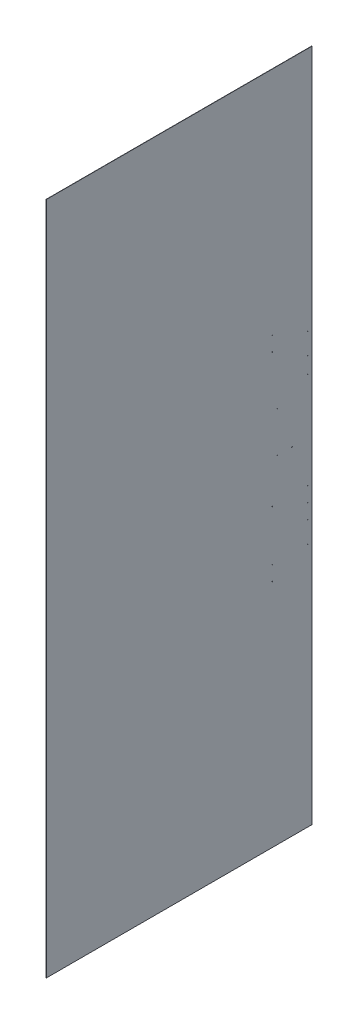
ISO-10303-21;
HEADER;
FILE_DESCRIPTION(('STEP AP214'),'2;1');
FILE_NAME('part.step','',(''),(''),'','','');
FILE_SCHEMA(('AUTOMOTIVE_DESIGN { 1 0 10303 214 1 1 1 1 }'));
ENDSEC;
DATA;
#1=APPLICATION_CONTEXT('core data for automotive mechanical design processes');
#2=APPLICATION_PROTOCOL_DEFINITION('international standard','automotive_design',2000,#1);
#3=PRODUCT_CONTEXT('',#1,'mechanical');
#4=PRODUCT('Part','Part','',(#3));
#5=PRODUCT_RELATED_PRODUCT_CATEGORY('part','',(#4));
#6=PRODUCT_DEFINITION_FORMATION('','',#4);
#7=PRODUCT_DEFINITION_CONTEXT('part definition',#1,'design');
#8=PRODUCT_DEFINITION('design','',#6,#7);
#9=PRODUCT_DEFINITION_SHAPE('','',#8);
#10=(LENGTH_UNIT() NAMED_UNIT(*) SI_UNIT(.MILLI.,.METRE.));
#11=(NAMED_UNIT(*) PLANE_ANGLE_UNIT() SI_UNIT($,.RADIAN.));
#12=(NAMED_UNIT(*) SI_UNIT($,.STERADIAN.) SOLID_ANGLE_UNIT());
#13=UNCERTAINTY_MEASURE_WITH_UNIT(LENGTH_MEASURE(1.E-05),#10,'distance_accuracy_value','');
#14=(GEOMETRIC_REPRESENTATION_CONTEXT(3) GLOBAL_UNCERTAINTY_ASSIGNED_CONTEXT((#13)) GLOBAL_UNIT_ASSIGNED_CONTEXT((#10,
#11,#12)) REPRESENTATION_CONTEXT('',''));
#15=CARTESIAN_POINT('',(0.,0.,0.));
#16=DIRECTION('',(0.,0.,1.));
#17=DIRECTION('',(1.,0.,0.));
#18=AXIS2_PLACEMENT_3D('',#15,#16,#17);
#19=CARTESIAN_POINT('',(1100.37499886222,-0.0500397908136385,1361.5));
#20=DIRECTION('',(-4.54752160072536E-05,-0.999999998966002,0.));
#21=DIRECTION('',(0.,0.,1.));
#22=AXIS2_PLACEMENT_3D('',#19,#20,#21);
#23=PLANE('',#22);
#24=DIRECTION('',(-0.999999998966002,4.54752160072536E-05,0.));
#25=VECTOR('',#24,1.);
#26=CARTESIAN_POINT('',(1100.37499886222,-0.0500397908131944,2723.));
#27=LINE('',#26,#25);
#28=CARTESIAN_POINT('',(1101.99999886054,-0.0501136880379782,2723.));
#29=VERTEX_POINT('',#28);
#30=CARTESIAN_POINT('',(1099.49999886312,-0.0499999999981071,2723.));
#31=VERTEX_POINT('',#30);
#32=EDGE_CURVE('E12',#29,#31,#27,.T.);
#33=ORIENTED_EDGE('',*,*,#32,.F.);
#34=DIRECTION('',(0.,0.,1.));
#35=VECTOR('',#34,1.);
#36=CARTESIAN_POINT('',(1101.99999886054,-0.0501136880379782,1361.5));
#37=LINE('',#36,#35);
#38=CARTESIAN_POINT('',(1101.99999886054,-0.0501136880379782,-4.44089209850063E-13));
#39=VERTEX_POINT('',#38);
#40=EDGE_CURVE('E79',#29,#39,#37,.F.);
#41=ORIENTED_EDGE('',*,*,#40,.T.);
#42=DIRECTION('',(-0.999999998966002,4.54752160072536E-05,0.));
#43=VECTOR('',#42,1.);
#44=CARTESIAN_POINT('',(1100.37499886222,-0.0500397908131944,0.));
#45=LINE('',#44,#43);
#46=CARTESIAN_POINT('',(1099.49999886312,-0.0499999999981071,-4.44089209850063E-13));
#47=VERTEX_POINT('',#46);
#48=EDGE_CURVE('E51',#39,#47,#45,.T.);
#49=ORIENTED_EDGE('',*,*,#48,.T.);
#50=DIRECTION('',(0.,0.,1.));
#51=VECTOR('',#50,1.);
#52=CARTESIAN_POINT('',(1099.49999886312,-0.0499999999981071,1361.5));
#53=LINE('',#52,#51);
#54=EDGE_CURVE('E81',#31,#47,#53,.F.);
#55=ORIENTED_EDGE('',*,*,#54,.F.);
#56=EDGE_LOOP('',(#33,#41,#49,#55));
#57=FACE_BOUND('',#56,.T.);
#58=ADVANCED_FACE('F41',(#57),#23,.F.);
#59=CARTESIAN_POINT('',(1100.21779649858,-3456.93001261945,-4.44089209850063E-13));
#60=DIRECTION('',(0.,0.,-1.));
#61=DIRECTION('',(-4.54752160072536E-05,-0.999999998966003,0.));
#62=AXIS2_PLACEMENT_3D('',#59,#60,#61);
#63=PLANE('',#62);
#64=ORIENTED_EDGE('',*,*,#48,.F.);
#65=DIRECTION('',(-4.54752160072536E-05,-0.999999998966003,0.));
#66=VECTOR('',#65,1.);
#67=CARTESIAN_POINT('',(1101.8427964969,-3456.93008651668,-4.44089209850063E-13));
#68=LINE('',#67,#66);
#69=CARTESIAN_POINT('',(1101.68559413326,-6913.81005934532,-1.11022302462516E-12));
#70=VERTEX_POINT('',#69);
#71=EDGE_CURVE('E93',#39,#70,#68,.T.);
#72=ORIENTED_EDGE('',*,*,#71,.T.);
#73=DIRECTION('',(-0.999999998966002,4.54752160072536E-05,0.));
#74=VECTOR('',#73,1.);
#75=CARTESIAN_POINT('',(1100.06059413494,-6913.80998544809,-6.66133814775094E-13));
#76=LINE('',#75,#74);
#77=CARTESIAN_POINT('',(1099.18559413584,-6913.80994565727,-1.11022302462516E-12));
#78=VERTEX_POINT('',#77);
#79=EDGE_CURVE('E103',#70,#78,#76,.T.);
#80=ORIENTED_EDGE('',*,*,#79,.T.);
#81=DIRECTION('',(-4.54752160072536E-05,-0.999999998966003,0.));
#82=VECTOR('',#81,1.);
#83=CARTESIAN_POINT('',(1099.34279649948,-3456.92997282864,-4.44089209850063E-13));
#84=LINE('',#83,#82);
#85=EDGE_CURVE('E98',#47,#78,#84,.T.);
#86=ORIENTED_EDGE('',*,*,#85,.F.);
#87=EDGE_LOOP('',(#64,#72,#80,#86));
#88=FACE_BOUND('',#87,.T.);
#89=ADVANCED_FACE('F111',(#88),#63,.T.);
#90=CARTESIAN_POINT('',(1100.06059413494,-6913.80998544809,1361.5));
#91=DIRECTION('',(-4.54752160072536E-05,-0.999999998966002,0.));
#92=DIRECTION('',(0.,0.,1.));
#93=AXIS2_PLACEMENT_3D('',#90,#91,#92);
#94=PLANE('',#93);
#95=ORIENTED_EDGE('',*,*,#79,.F.);
#96=DIRECTION('',(0.,0.,1.));
#97=VECTOR('',#96,1.);
#98=CARTESIAN_POINT('',(1101.68559413326,-6913.81005934532,1361.5));
#99=LINE('',#98,#97);
#100=CARTESIAN_POINT('',(1101.68559413326,-6913.81005934532,2723.));
#101=VERTEX_POINT('',#100);
#102=EDGE_CURVE('E96',#70,#101,#99,.T.);
#103=ORIENTED_EDGE('',*,*,#102,.T.);
#104=DIRECTION('',(-0.999999998966002,4.54752160072536E-05,0.));
#105=VECTOR('',#104,1.);
#106=CARTESIAN_POINT('',(1100.06059413494,-6913.80998544809,2723.));
#107=LINE('',#106,#105);
#108=CARTESIAN_POINT('',(1099.18559413584,-6913.80994565728,2723.));
#109=VERTEX_POINT('',#108);
#110=EDGE_CURVE('E45',#101,#109,#107,.T.);
#111=ORIENTED_EDGE('',*,*,#110,.T.);
#112=DIRECTION('',(0.,0.,1.));
#113=VECTOR('',#112,1.);
#114=CARTESIAN_POINT('',(1099.18559413584,-6913.80994565727,1361.5));
#115=LINE('',#114,#113);
#116=EDGE_CURVE('E112',#78,#109,#115,.T.);
#117=ORIENTED_EDGE('',*,*,#116,.F.);
#118=EDGE_LOOP('',(#95,#103,#111,#117));
#119=FACE_BOUND('',#118,.T.);
#120=ADVANCED_FACE('F255',(#119),#94,.T.);
#121=CARTESIAN_POINT('',(1100.21779649858,-3456.93001261945,2723.));
#122=DIRECTION('',(0.,0.,-1.));
#123=DIRECTION('',(-4.54752160072536E-05,-0.999999998966003,0.));
#124=AXIS2_PLACEMENT_3D('',#121,#122,#123);
#125=PLANE('',#124);
#126=DIRECTION('',(-4.54752160072536E-05,-0.999999998966003,0.));
#127=VECTOR('',#126,1.);
#128=CARTESIAN_POINT('',(1101.8427964969,-3456.93008651668,2723.));
#129=LINE('',#128,#127);
#130=EDGE_CURVE('E91',#101,#29,#129,.F.);
#131=ORIENTED_EDGE('',*,*,#130,.T.);
#132=ORIENTED_EDGE('',*,*,#32,.T.);
#133=DIRECTION('',(-4.54752160072536E-05,-0.999999998966003,0.));
#134=VECTOR('',#133,1.);
#135=CARTESIAN_POINT('',(1099.34279649948,-3456.92997282864,2723.));
#136=LINE('',#135,#134);
#137=EDGE_CURVE('E110',#109,#31,#136,.F.);
#138=ORIENTED_EDGE('',*,*,#137,.F.);
#139=ORIENTED_EDGE('',*,*,#110,.F.);
#140=EDGE_LOOP('',(#131,#132,#138,#139));
#141=FACE_BOUND('',#140,.T.);
#142=ADVANCED_FACE('F43',(#141),#125,.F.);
#143=CARTESIAN_POINT('',(1099.34279649948,-3456.92997282864,1361.5));
#144=DIRECTION('',(-0.999999998966002,4.54752160072536E-05,0.));
#145=DIRECTION('',(-4.54752160072536E-05,-0.999999998966003,0.));
#146=AXIS2_PLACEMENT_3D('',#143,#144,#145);
#147=PLANE('',#146);
#148=CARTESIAN_POINT('',(1099.3165482048,-4034.12997223181,44.5999999999986));
#149=DIRECTION('',(-0.999999998966002,4.54752160072536E-05,0.));
#150=DIRECTION('',(-4.54752160072536E-05,-0.999999998966002,0.));
#151=AXIS2_PLACEMENT_3D('',#148,#149,#150);
#152=CIRCLE('',#151,2.99999999999997);
#153=CARTESIAN_POINT('',(1099.31641177915,-4037.12997222871,44.5999999999986));
#154=VERTEX_POINT('',#153);
#155=EDGE_CURVE('E191',#154,#154,#152,.F.);
#156=ORIENTED_EDGE('',*,*,#155,.T.);
#157=EDGE_LOOP('',(#156));
#158=FACE_BOUND('',#157,.T.);
#159=CARTESIAN_POINT('',(1099.30974966001,-4183.62997207723,44.5999999999984));
#160=DIRECTION('',(-0.999999998966002,4.54752160072536E-05,0.));
#161=DIRECTION('',(-4.54752160072536E-05,-0.999999998966002,0.));
#162=AXIS2_PLACEMENT_3D('',#159,#160,#161);
#163=CIRCLE('',#162,2.99999999999997);
#164=CARTESIAN_POINT('',(1099.30961323436,-4186.62997207413,44.5999999999984));
#165=VERTEX_POINT('',#164);
#166=EDGE_CURVE('E184',#165,#165,#163,.F.);
#167=ORIENTED_EDGE('',*,*,#166,.T.);
#168=EDGE_LOOP('',(#167));
#169=FACE_BOUND('',#168,.T.);
#170=CARTESIAN_POINT('',(1099.29984970548,-4401.32997185213,44.5999999999984));
#171=DIRECTION('',(-0.999999998966002,4.54752160072536E-05,0.));
#172=DIRECTION('',(-4.54752160072536E-05,-0.999999998966002,0.));
#173=AXIS2_PLACEMENT_3D('',#170,#171,#172);
#174=CIRCLE('',#173,2.99999999999997);
#175=CARTESIAN_POINT('',(1099.29971327984,-4404.32997184903,44.5999999999984));
#176=VERTEX_POINT('',#175);
#177=EDGE_CURVE('E201',#176,#176,#174,.F.);
#178=ORIENTED_EDGE('',*,*,#177,.T.);
#179=EDGE_LOOP('',(#178));
#180=FACE_BOUND('',#179,.T.);
#181=CARTESIAN_POINT('',(1099.34279649948,-3456.92997282864,204.299999999999));
#182=DIRECTION('',(-0.999999998966002,4.54752160072536E-05,0.));
#183=DIRECTION('',(-4.54752160072536E-05,-0.999999998966002,0.));
#184=AXIS2_PLACEMENT_3D('',#181,#182,#183);
#185=CIRCLE('',#184,2.99999999999996);
#186=CARTESIAN_POINT('',(1099.34266007383,-3459.92997282553,204.299999999999));
#187=VERTEX_POINT('',#186);
#188=EDGE_CURVE('E142',#187,#187,#185,.F.);
#189=ORIENTED_EDGE('',*,*,#188,.T.);
#190=EDGE_LOOP('',(#189));
#191=FACE_BOUND('',#190,.T.);
#192=CARTESIAN_POINT('',(1099.3233467496,-3884.62997238639,44.5999999999986));
#193=DIRECTION('',(-0.999999998966002,4.54752160072536E-05,0.));
#194=DIRECTION('',(-4.54752160072536E-05,-0.999999998966002,0.));
#195=AXIS2_PLACEMENT_3D('',#192,#193,#194);
#196=CIRCLE('',#195,2.99999999999997);
#197=CARTESIAN_POINT('',(1099.32321032395,-3887.62997238329,44.5999999999986));
#198=VERTEX_POINT('',#197);
#199=EDGE_CURVE('E166',#198,#198,#196,.F.);
#200=ORIENTED_EDGE('',*,*,#199,.T.);
#201=EDGE_LOOP('',(#200));
#202=FACE_BOUND('',#201,.T.);
#203=CARTESIAN_POINT('',(1099.36840359362,-2893.82997341088,44.5999999999986));
#204=DIRECTION('',(-0.999999998966002,4.54752160072536E-05,0.));
#205=DIRECTION('',(-4.54752160072536E-05,-0.999999998966002,0.));
#206=AXIS2_PLACEMENT_3D('',#203,#204,#205);
#207=CIRCLE('',#206,2.99999999999997);
#208=CARTESIAN_POINT('',(1099.36826716797,-2896.82997340778,44.5999999999986));
#209=VERTEX_POINT('',#208);
#210=EDGE_CURVE('E173',#209,#209,#207,.F.);
#211=ORIENTED_EDGE('',*,*,#210,.T.);
#212=EDGE_LOOP('',(#211));
#213=FACE_BOUND('',#212,.T.);
#214=CARTESIAN_POINT('',(1099.37584333895,-2730.22997358004,44.5999999999986));
#215=DIRECTION('',(-0.999999998966002,4.54752160072536E-05,0.));
#216=DIRECTION('',(-4.54752160072536E-05,-0.999999998966002,0.));
#217=AXIS2_PLACEMENT_3D('',#214,#215,#216);
#218=CIRCLE('',#217,2.99999999999997);
#219=CARTESIAN_POINT('',(1099.37570691331,-2733.22997357694,44.5999999999986));
#220=VERTEX_POINT('',#219);
#221=EDGE_CURVE('E179',#220,#220,#218,.F.);
#222=ORIENTED_EDGE('',*,*,#221,.T.);
#223=EDGE_LOOP('',(#222));
#224=FACE_BOUND('',#223,.T.);
#225=CARTESIAN_POINT('',(1099.38574329348,-2512.52997380514,405.199999999998));
#226=DIRECTION('',(-0.999999998966002,4.54752160072536E-05,0.));
#227=DIRECTION('',(-4.54752160072536E-05,-0.999999998966002,0.));
#228=AXIS2_PLACEMENT_3D('',#225,#226,#227);
#229=CIRCLE('',#228,2.99999999999996);
#230=CARTESIAN_POINT('',(1099.38560686783,-2515.52997380204,405.199999999998));
#231=VERTEX_POINT('',#230);
#232=EDGE_CURVE('E150',#231,#231,#229,.F.);
#233=ORIENTED_EDGE('',*,*,#232,.T.);
#234=EDGE_LOOP('',(#233));
#235=FACE_BOUND('',#234,.T.);
#236=CARTESIAN_POINT('',(1099.29305116069,-4550.82997169755,405.199999999998));
#237=DIRECTION('',(-0.999999998966002,4.54752160072536E-05,0.));
#238=DIRECTION('',(-4.54752160072536E-05,-0.999999998966002,0.));
#239=AXIS2_PLACEMENT_3D('',#236,#237,#238);
#240=CIRCLE('',#239,2.99999999999996);
#241=CARTESIAN_POINT('',(1099.29291473504,-4553.82997169444,405.199999999998));
#242=VERTEX_POINT('',#241);
#243=EDGE_CURVE('E143',#242,#242,#240,.F.);
#244=ORIENTED_EDGE('',*,*,#243,.T.);
#245=EDGE_LOOP('',(#244));
#246=FACE_BOUND('',#245,.T.);
#247=CARTESIAN_POINT('',(1099.29984970548,-4401.32997185213,405.199999999998));
#248=DIRECTION('',(-0.999999998966002,4.54752160072536E-05,0.));
#249=DIRECTION('',(-4.54752160072536E-05,-0.999999998966002,0.));
#250=AXIS2_PLACEMENT_3D('',#247,#248,#249);
#251=CIRCLE('',#250,2.99999999999996);
#252=CARTESIAN_POINT('',(1099.29971327984,-4404.32997184903,405.199999999998));
#253=VERTEX_POINT('',#252);
#254=EDGE_CURVE('E161',#253,#253,#251,.F.);
#255=ORIENTED_EDGE('',*,*,#254,.T.);
#256=EDGE_LOOP('',(#255));
#257=FACE_BOUND('',#256,.T.);
#258=CARTESIAN_POINT('',(1099.3233467496,-3884.62997238639,405.199999999998));
#259=DIRECTION('',(-0.999999998966002,4.54752160072536E-05,0.));
#260=DIRECTION('',(-4.54752160072536E-05,-0.999999998966002,0.));
#261=AXIS2_PLACEMENT_3D('',#258,#259,#260);
#262=CIRCLE('',#261,2.99999999999996);
#263=CARTESIAN_POINT('',(1099.32321032395,-3887.62997238329,405.199999999998));
#264=VERTEX_POINT('',#263);
#265=EDGE_CURVE('E155',#264,#264,#262,.F.);
#266=ORIENTED_EDGE('',*,*,#265,.T.);
#267=EDGE_LOOP('',(#266));
#268=FACE_BOUND('',#267,.T.);
#269=CARTESIAN_POINT('',(1099.39254183827,-2363.02997395973,405.199999999998));
#270=DIRECTION('',(-0.999999998966002,4.54752160072536E-05,0.));
#271=DIRECTION('',(-4.54752160072536E-05,-0.999999998966002,0.));
#272=AXIS2_PLACEMENT_3D('',#269,#270,#271);
#273=CIRCLE('',#272,2.99999999999996);
#274=CARTESIAN_POINT('',(1099.39240541262,-2366.02997395662,405.199999999998));
#275=VERTEX_POINT('',#274);
#276=EDGE_CURVE('E123',#275,#275,#273,.F.);
#277=ORIENTED_EDGE('',*,*,#276,.T.);
#278=EDGE_LOOP('',(#277));
#279=FACE_BOUND('',#278,.T.);
#280=CARTESIAN_POINT('',(1099.36170964182,-3041.02997325868,353.699999999999));
#281=DIRECTION('',(-0.999999998966002,4.54752160072536E-05,0.));
#282=DIRECTION('',(-4.54752160072536E-05,-0.999999998966002,0.));
#283=AXIS2_PLACEMENT_3D('',#280,#281,#282);
#284=CIRCLE('',#283,2.99999999999996);
#285=CARTESIAN_POINT('',(1099.36157321617,-3044.02997325557,353.699999999999));
#286=VERTEX_POINT('',#285);
#287=EDGE_CURVE('E130',#286,#286,#284,.F.);
#288=ORIENTED_EDGE('',*,*,#287,.T.);
#289=EDGE_LOOP('',(#288));
#290=FACE_BOUND('',#289,.T.);
#291=CARTESIAN_POINT('',(1099.34279649948,-3456.92997282864,353.699999999999));
#292=DIRECTION('',(-0.999999998966002,4.54752160072536E-05,0.));
#293=DIRECTION('',(-4.54752160072536E-05,-0.999999998966002,0.));
#294=AXIS2_PLACEMENT_3D('',#291,#292,#293);
#295=CIRCLE('',#294,2.99999999999996);
#296=CARTESIAN_POINT('',(1099.34266007383,-3459.92997282553,353.699999999999));
#297=VERTEX_POINT('',#296);
#298=EDGE_CURVE('E136',#297,#297,#295,.F.);
#299=ORIENTED_EDGE('',*,*,#298,.T.);
#300=EDGE_LOOP('',(#299));
#301=FACE_BOUND('',#300,.T.);
#302=CARTESIAN_POINT('',(1099.38574329348,-2512.52997380514,44.5999999999985));
#303=DIRECTION('',(-0.999999998966002,4.54752160072536E-05,0.));
#304=DIRECTION('',(-4.54752160072536E-05,-0.999999998966002,0.));
#305=AXIS2_PLACEMENT_3D('',#302,#303,#304);
#306=CIRCLE('',#305,2.99999999999997);
#307=CARTESIAN_POINT('',(1099.38560686783,-2515.52997380204,44.5999999999985));
#308=VERTEX_POINT('',#307);
#309=EDGE_CURVE('E117',#308,#308,#306,.F.);
#310=ORIENTED_EDGE('',*,*,#309,.T.);
#311=EDGE_LOOP('',(#310));
#312=FACE_BOUND('',#311,.T.);
#313=ORIENTED_EDGE('',*,*,#116,.T.);
#314=ORIENTED_EDGE('',*,*,#137,.T.);
#315=ORIENTED_EDGE('',*,*,#54,.T.);
#316=ORIENTED_EDGE('',*,*,#85,.T.);
#317=EDGE_LOOP('',(#313,#314,#315,#316));
#318=FACE_BOUND('',#317,.T.);
#319=ADVANCED_FACE('F109',(#158,#169,#180,#191,#202,#213,#224,#235,#246,#257,#268,#279,#290,
#301,#312,#318),#147,.T.);
#320=CARTESIAN_POINT('',(1101.8427964969,-3456.93008651668,1361.5));
#321=DIRECTION('',(-0.999999998966002,4.54752160072536E-05,0.));
#322=DIRECTION('',(-4.54752160072536E-05,-0.999999998966003,0.));
#323=AXIS2_PLACEMENT_3D('',#320,#321,#322);
#324=PLANE('',#323);
#325=CARTESIAN_POINT('',(1101.81654820222,-4034.13008591985,44.5999999999986));
#326=DIRECTION('',(0.999999998966003,-4.54752160072536E-05,0.));
#327=DIRECTION('',(4.54752160072536E-05,0.999999998966002,0.));
#328=AXIS2_PLACEMENT_3D('',#325,#326,#327);
#329=CIRCLE('',#328,2.99999999999997);
#330=CARTESIAN_POINT('',(1101.81668462787,-4031.13008592295,44.5999999999986));
#331=VERTEX_POINT('',#330);
#332=EDGE_CURVE('E170',#331,#331,#329,.T.);
#333=ORIENTED_EDGE('',*,*,#332,.F.);
#334=EDGE_LOOP('',(#333));
#335=FACE_BOUND('',#334,.T.);
#336=CARTESIAN_POINT('',(1101.80974965742,-4183.63008576527,44.5999999999984));
#337=DIRECTION('',(0.999999998966003,-4.54752160072536E-05,0.));
#338=DIRECTION('',(4.54752160072536E-05,0.999999998966002,0.));
#339=AXIS2_PLACEMENT_3D('',#336,#337,#338);
#340=CIRCLE('',#339,2.99999999999997);
#341=CARTESIAN_POINT('',(1101.80988608307,-4180.63008576837,44.5999999999984));
#342=VERTEX_POINT('',#341);
#343=EDGE_CURVE('E187',#342,#342,#340,.T.);
#344=ORIENTED_EDGE('',*,*,#343,.F.);
#345=EDGE_LOOP('',(#344));
#346=FACE_BOUND('',#345,.T.);
#347=CARTESIAN_POINT('',(1101.7998497029,-4401.33008554017,44.5999999999984));
#348=DIRECTION('',(0.999999998966003,-4.54752160072536E-05,0.));
#349=DIRECTION('',(4.54752160072536E-05,0.999999998966002,0.));
#350=AXIS2_PLACEMENT_3D('',#347,#348,#349);
#351=CIRCLE('',#350,2.99999999999997);
#352=CARTESIAN_POINT('',(1101.79998612855,-4398.33008554327,44.5999999999984));
#353=VERTEX_POINT('',#352);
#354=EDGE_CURVE('E188',#353,#353,#351,.T.);
#355=ORIENTED_EDGE('',*,*,#354,.F.);
#356=EDGE_LOOP('',(#355));
#357=FACE_BOUND('',#356,.T.);
#358=CARTESIAN_POINT('',(1101.8427964969,-3456.93008651668,204.299999999999));
#359=DIRECTION('',(0.999999998966003,-4.54752160072536E-05,0.));
#360=DIRECTION('',(4.54752160072536E-05,0.999999998966002,0.));
#361=AXIS2_PLACEMENT_3D('',#358,#359,#360);
#362=CIRCLE('',#361,2.99999999999996);
#363=CARTESIAN_POINT('',(1101.84293292255,-3453.93008651978,204.299999999999));
#364=VERTEX_POINT('',#363);
#365=EDGE_CURVE('E198',#364,#364,#362,.T.);
#366=ORIENTED_EDGE('',*,*,#365,.F.);
#367=EDGE_LOOP('',(#366));
#368=FACE_BOUND('',#367,.T.);
#369=CARTESIAN_POINT('',(1101.82334674701,-3884.63008607443,44.5999999999986));
#370=DIRECTION('',(0.999999998966003,-4.54752160072536E-05,0.));
#371=DIRECTION('',(4.54752160072536E-05,0.999999998966002,0.));
#372=AXIS2_PLACEMENT_3D('',#369,#370,#371);
#373=CIRCLE('',#372,2.99999999999997);
#374=CARTESIAN_POINT('',(1101.82348317266,-3881.63008607754,44.5999999999986));
#375=VERTEX_POINT('',#374);
#376=EDGE_CURVE('E169',#375,#375,#373,.T.);
#377=ORIENTED_EDGE('',*,*,#376,.F.);
#378=EDGE_LOOP('',(#377));
#379=FACE_BOUND('',#378,.T.);
#380=CARTESIAN_POINT('',(1101.86840359103,-2893.83008709892,44.5999999999986));
#381=DIRECTION('',(0.999999998966003,-4.54752160072536E-05,0.));
#382=DIRECTION('',(4.54752160072536E-05,0.999999998966002,0.));
#383=AXIS2_PLACEMENT_3D('',#380,#381,#382);
#384=CIRCLE('',#383,2.99999999999997);
#385=CARTESIAN_POINT('',(1101.86854001668,-2890.83008710202,44.5999999999986));
#386=VERTEX_POINT('',#385);
#387=EDGE_CURVE('E176',#386,#386,#384,.T.);
#388=ORIENTED_EDGE('',*,*,#387,.F.);
#389=EDGE_LOOP('',(#388));
#390=FACE_BOUND('',#389,.T.);
#391=CARTESIAN_POINT('',(1101.87584333637,-2730.23008726808,44.5999999999986));
#392=DIRECTION('',(0.999999998966003,-4.54752160072536E-05,0.));
#393=DIRECTION('',(4.54752160072536E-05,0.999999998966002,0.));
#394=AXIS2_PLACEMENT_3D('',#391,#392,#393);
#395=CIRCLE('',#394,2.99999999999997);
#396=CARTESIAN_POINT('',(1101.87597976202,-2727.23008727118,44.5999999999986));
#397=VERTEX_POINT('',#396);
#398=EDGE_CURVE('E120',#397,#397,#395,.T.);
#399=ORIENTED_EDGE('',*,*,#398,.F.);
#400=EDGE_LOOP('',(#399));
#401=FACE_BOUND('',#400,.T.);
#402=CARTESIAN_POINT('',(1101.88574329089,-2512.53008749318,405.199999999998));
#403=DIRECTION('',(0.999999998966003,-4.54752160072536E-05,0.));
#404=DIRECTION('',(4.54752160072536E-05,0.999999998966002,0.));
#405=AXIS2_PLACEMENT_3D('',#402,#403,#404);
#406=CIRCLE('',#405,2.99999999999996);
#407=CARTESIAN_POINT('',(1101.88587971654,-2509.53008749628,405.199999999998));
#408=VERTEX_POINT('',#407);
#409=EDGE_CURVE('E127',#408,#408,#406,.T.);
#410=ORIENTED_EDGE('',*,*,#409,.F.);
#411=EDGE_LOOP('',(#410));
#412=FACE_BOUND('',#411,.T.);
#413=CARTESIAN_POINT('',(1101.79305115811,-4550.83008538559,405.199999999998));
#414=DIRECTION('',(0.999999998966003,-4.54752160072536E-05,0.));
#415=DIRECTION('',(4.54752160072536E-05,0.999999998966002,0.));
#416=AXIS2_PLACEMENT_3D('',#413,#414,#415);
#417=CIRCLE('',#416,2.99999999999996);
#418=CARTESIAN_POINT('',(1101.79318758375,-4547.83008538869,405.199999999998));
#419=VERTEX_POINT('',#418);
#420=EDGE_CURVE('E146',#419,#419,#417,.T.);
#421=ORIENTED_EDGE('',*,*,#420,.F.);
#422=EDGE_LOOP('',(#421));
#423=FACE_BOUND('',#422,.T.);
#424=CARTESIAN_POINT('',(1101.7998497029,-4401.33008554017,405.199999999998));
#425=DIRECTION('',(0.999999998966003,-4.54752160072536E-05,0.));
#426=DIRECTION('',(4.54752160072536E-05,0.999999998966002,0.));
#427=AXIS2_PLACEMENT_3D('',#424,#425,#426);
#428=CIRCLE('',#427,2.99999999999996);
#429=CARTESIAN_POINT('',(1101.79998612855,-4398.33008554327,405.199999999998));
#430=VERTEX_POINT('',#429);
#431=EDGE_CURVE('E147',#430,#430,#428,.T.);
#432=ORIENTED_EDGE('',*,*,#431,.F.);
#433=EDGE_LOOP('',(#432));
#434=FACE_BOUND('',#433,.T.);
#435=CARTESIAN_POINT('',(1101.82334674701,-3884.63008607443,405.199999999998));
#436=DIRECTION('',(0.999999998966003,-4.54752160072536E-05,0.));
#437=DIRECTION('',(4.54752160072536E-05,0.999999998966002,0.));
#438=AXIS2_PLACEMENT_3D('',#435,#436,#437);
#439=CIRCLE('',#438,2.99999999999996);
#440=CARTESIAN_POINT('',(1101.82348317266,-3881.63008607754,405.199999999998));
#441=VERTEX_POINT('',#440);
#442=EDGE_CURVE('E158',#441,#441,#439,.T.);
#443=ORIENTED_EDGE('',*,*,#442,.F.);
#444=EDGE_LOOP('',(#443));
#445=FACE_BOUND('',#444,.T.);
#446=CARTESIAN_POINT('',(1101.89254183569,-2363.03008764777,405.199999999998));
#447=DIRECTION('',(0.999999998966003,-4.54752160072536E-05,0.));
#448=DIRECTION('',(4.54752160072536E-05,0.999999998966002,0.));
#449=AXIS2_PLACEMENT_3D('',#446,#447,#448);
#450=CIRCLE('',#449,2.99999999999996);
#451=CARTESIAN_POINT('',(1101.89267826134,-2360.03008765087,405.199999999998));
#452=VERTEX_POINT('',#451);
#453=EDGE_CURVE('E126',#452,#452,#450,.T.);
#454=ORIENTED_EDGE('',*,*,#453,.F.);
#455=EDGE_LOOP('',(#454));
#456=FACE_BOUND('',#455,.T.);
#457=CARTESIAN_POINT('',(1101.86170963923,-3041.03008694672,353.699999999999));
#458=DIRECTION('',(0.999999998966003,-4.54752160072536E-05,0.));
#459=DIRECTION('',(4.54752160072536E-05,0.999999998966002,0.));
#460=AXIS2_PLACEMENT_3D('',#457,#458,#459);
#461=CIRCLE('',#460,2.99999999999996);
#462=CARTESIAN_POINT('',(1101.86184606488,-3038.03008694982,353.699999999999));
#463=VERTEX_POINT('',#462);
#464=EDGE_CURVE('E133',#463,#463,#461,.T.);
#465=ORIENTED_EDGE('',*,*,#464,.F.);
#466=EDGE_LOOP('',(#465));
#467=FACE_BOUND('',#466,.T.);
#468=CARTESIAN_POINT('',(1101.8427964969,-3456.93008651668,353.699999999999));
#469=DIRECTION('',(0.999999998966003,-4.54752160072536E-05,0.));
#470=DIRECTION('',(4.54752160072536E-05,0.999999998966002,0.));
#471=AXIS2_PLACEMENT_3D('',#468,#469,#470);
#472=CIRCLE('',#471,2.99999999999996);
#473=CARTESIAN_POINT('',(1101.84293292255,-3453.93008651978,353.699999999999));
#474=VERTEX_POINT('',#473);
#475=EDGE_CURVE('E139',#474,#474,#472,.T.);
#476=ORIENTED_EDGE('',*,*,#475,.F.);
#477=EDGE_LOOP('',(#476));
#478=FACE_BOUND('',#477,.T.);
#479=CARTESIAN_POINT('',(1101.88574329089,-2512.53008749318,44.5999999999985));
#480=DIRECTION('',(0.999999998966003,-4.54752160072536E-05,0.));
#481=DIRECTION('',(4.54752160072536E-05,0.999999998966002,0.));
#482=AXIS2_PLACEMENT_3D('',#479,#480,#481);
#483=CIRCLE('',#482,2.99999999999997);
#484=CARTESIAN_POINT('',(1101.88587971654,-2509.53008749628,44.5999999999985));
#485=VERTEX_POINT('',#484);
#486=EDGE_CURVE('E94',#485,#485,#483,.T.);
#487=ORIENTED_EDGE('',*,*,#486,.F.);
#488=EDGE_LOOP('',(#487));
#489=FACE_BOUND('',#488,.T.);
#490=ORIENTED_EDGE('',*,*,#102,.F.);
#491=ORIENTED_EDGE('',*,*,#71,.F.);
#492=ORIENTED_EDGE('',*,*,#40,.F.);
#493=ORIENTED_EDGE('',*,*,#130,.F.);
#494=EDGE_LOOP('',(#490,#491,#492,#493));
#495=FACE_BOUND('',#494,.T.);
#496=ADVANCED_FACE('F90',(#335,#346,#357,#368,#379,#390,#401,#412,#423,#434,#445,#456,#467,#478,
#489,#495),#324,.F.);
#497=CARTESIAN_POINT('',(1099.07033852138,-2512.52995946204,44.5999999999985));
#498=DIRECTION('',(0.999999998966002,-4.54752160072536E-05,0.));
#499=DIRECTION('',(4.54752160072536E-05,0.999999998966003,0.));
#500=AXIS2_PLACEMENT_3D('',#497,#498,#499);
#501=CYLINDRICAL_SURFACE('',#500,2.99999999999997);
#502=ORIENTED_EDGE('',*,*,#309,.F.);
#503=EDGE_LOOP('',(#502));
#504=FACE_BOUND('',#503,.T.);
#505=ORIENTED_EDGE('',*,*,#486,.T.);
#506=EDGE_LOOP('',(#505));
#507=FACE_BOUND('',#506,.T.);
#508=ADVANCED_FACE('F211',(#504,#507),#501,.F.);
#509=CARTESIAN_POINT('',(1099.02739172738,-3456.92995848554,353.699999999999));
#510=DIRECTION('',(0.999999998966002,-4.54752160072536E-05,0.));
#511=DIRECTION('',(4.54752160072536E-05,0.999999998966003,0.));
#512=AXIS2_PLACEMENT_3D('',#509,#510,#511);
#513=CYLINDRICAL_SURFACE('',#512,2.99999999999996);
#514=ORIENTED_EDGE('',*,*,#298,.F.);
#515=EDGE_LOOP('',(#514));
#516=FACE_BOUND('',#515,.T.);
#517=ORIENTED_EDGE('',*,*,#475,.T.);
#518=EDGE_LOOP('',(#517));
#519=FACE_BOUND('',#518,.T.);
#520=ADVANCED_FACE('F239',(#516,#519),#513,.F.);
#521=CARTESIAN_POINT('',(1099.04630486972,-3041.02995891558,353.699999999999));
#522=DIRECTION('',(0.999999998966002,-4.54752160072536E-05,0.));
#523=DIRECTION('',(4.54752160072536E-05,0.999999998966003,0.));
#524=AXIS2_PLACEMENT_3D('',#521,#522,#523);
#525=CYLINDRICAL_SURFACE('',#524,2.99999999999996);
#526=ORIENTED_EDGE('',*,*,#287,.F.);
#527=EDGE_LOOP('',(#526));
#528=FACE_BOUND('',#527,.T.);
#529=ORIENTED_EDGE('',*,*,#464,.T.);
#530=EDGE_LOOP('',(#529));
#531=FACE_BOUND('',#530,.T.);
#532=ADVANCED_FACE('F245',(#528,#531),#525,.F.);
#533=CARTESIAN_POINT('',(1099.07713706617,-2363.02995961663,405.199999999998));
#534=DIRECTION('',(0.999999998966002,-4.54752160072536E-05,0.));
#535=DIRECTION('',(4.54752160072536E-05,0.999999998966003,0.));
#536=AXIS2_PLACEMENT_3D('',#533,#534,#535);
#537=CYLINDRICAL_SURFACE('',#536,2.99999999999996);
#538=ORIENTED_EDGE('',*,*,#276,.F.);
#539=EDGE_LOOP('',(#538));
#540=FACE_BOUND('',#539,.T.);
#541=ORIENTED_EDGE('',*,*,#453,.T.);
#542=EDGE_LOOP('',(#541));
#543=FACE_BOUND('',#542,.T.);
#544=ADVANCED_FACE('F296',(#540,#543),#537,.F.);
#545=CARTESIAN_POINT('',(1099.0079419775,-3884.62995804329,405.199999999998));
#546=DIRECTION('',(0.999999998966002,-4.54752160072536E-05,0.));
#547=DIRECTION('',(4.54752160072536E-05,0.999999998966003,0.));
#548=AXIS2_PLACEMENT_3D('',#545,#546,#547);
#549=CYLINDRICAL_SURFACE('',#548,2.99999999999996);
#550=ORIENTED_EDGE('',*,*,#265,.F.);
#551=EDGE_LOOP('',(#550));
#552=FACE_BOUND('',#551,.T.);
#553=ORIENTED_EDGE('',*,*,#442,.T.);
#554=EDGE_LOOP('',(#553));
#555=FACE_BOUND('',#554,.T.);
#556=ADVANCED_FACE('F301',(#552,#555),#549,.F.);
#557=CARTESIAN_POINT('',(1098.98444493339,-4401.32995750903,405.199999999998));
#558=DIRECTION('',(0.999999998966002,-4.54752160072536E-05,0.));
#559=DIRECTION('',(4.54752160072536E-05,0.999999998966003,0.));
#560=AXIS2_PLACEMENT_3D('',#557,#558,#559);
#561=CYLINDRICAL_SURFACE('',#560,2.99999999999996);
#562=ORIENTED_EDGE('',*,*,#254,.F.);
#563=EDGE_LOOP('',(#562));
#564=FACE_BOUND('',#563,.T.);
#565=ORIENTED_EDGE('',*,*,#431,.T.);
#566=EDGE_LOOP('',(#565));
#567=FACE_BOUND('',#566,.T.);
#568=ADVANCED_FACE('F308',(#564,#567),#561,.F.);
#569=CARTESIAN_POINT('',(1098.97764638859,-4550.82995735444,405.199999999998));
#570=DIRECTION('',(0.999999998966002,-4.54752160072536E-05,0.));
#571=DIRECTION('',(4.54752160072536E-05,0.999999998966003,0.));
#572=AXIS2_PLACEMENT_3D('',#569,#570,#571);
#573=CYLINDRICAL_SURFACE('',#572,2.99999999999996);
#574=ORIENTED_EDGE('',*,*,#243,.F.);
#575=EDGE_LOOP('',(#574));
#576=FACE_BOUND('',#575,.T.);
#577=ORIENTED_EDGE('',*,*,#420,.T.);
#578=EDGE_LOOP('',(#577));
#579=FACE_BOUND('',#578,.T.);
#580=ADVANCED_FACE('F304',(#576,#579),#573,.F.);
#581=CARTESIAN_POINT('',(1099.07033852138,-2512.52995946204,405.199999999998));
#582=DIRECTION('',(0.999999998966002,-4.54752160072536E-05,0.));
#583=DIRECTION('',(4.54752160072536E-05,0.999999998966003,0.));
#584=AXIS2_PLACEMENT_3D('',#581,#582,#583);
#585=CYLINDRICAL_SURFACE('',#584,2.99999999999996);
#586=ORIENTED_EDGE('',*,*,#232,.F.);
#587=EDGE_LOOP('',(#586));
#588=FACE_BOUND('',#587,.T.);
#589=ORIENTED_EDGE('',*,*,#409,.T.);
#590=EDGE_LOOP('',(#589));
#591=FACE_BOUND('',#590,.T.);
#592=ADVANCED_FACE('F307',(#588,#591),#585,.F.);
#593=CARTESIAN_POINT('',(1099.06043856686,-2730.22995923694,44.5999999999986));
#594=DIRECTION('',(0.999999998966002,-4.54752160072536E-05,0.));
#595=DIRECTION('',(4.54752160072536E-05,0.999999998966003,0.));
#596=AXIS2_PLACEMENT_3D('',#593,#594,#595);
#597=CYLINDRICAL_SURFACE('',#596,2.99999999999997);
#598=ORIENTED_EDGE('',*,*,#221,.F.);
#599=EDGE_LOOP('',(#598));
#600=FACE_BOUND('',#599,.T.);
#601=ORIENTED_EDGE('',*,*,#398,.T.);
#602=EDGE_LOOP('',(#601));
#603=FACE_BOUND('',#602,.T.);
#604=ADVANCED_FACE('F312',(#600,#603),#597,.F.);
#605=CARTESIAN_POINT('',(1099.05299882152,-2893.82995906778,44.5999999999986));
#606=DIRECTION('',(0.999999998966002,-4.54752160072536E-05,0.));
#607=DIRECTION('',(4.54752160072536E-05,0.999999998966003,0.));
#608=AXIS2_PLACEMENT_3D('',#605,#606,#607);
#609=CYLINDRICAL_SURFACE('',#608,2.99999999999997);
#610=ORIENTED_EDGE('',*,*,#210,.F.);
#611=EDGE_LOOP('',(#610));
#612=FACE_BOUND('',#611,.T.);
#613=ORIENTED_EDGE('',*,*,#387,.T.);
#614=EDGE_LOOP('',(#613));
#615=FACE_BOUND('',#614,.T.);
#616=ADVANCED_FACE('F324',(#612,#615),#609,.F.);
#617=CARTESIAN_POINT('',(1099.0079419775,-3884.62995804329,44.5999999999986));
#618=DIRECTION('',(0.999999998966002,-4.54752160072536E-05,0.));
#619=DIRECTION('',(4.54752160072536E-05,0.999999998966003,0.));
#620=AXIS2_PLACEMENT_3D('',#617,#618,#619);
#621=CYLINDRICAL_SURFACE('',#620,2.99999999999997);
#622=ORIENTED_EDGE('',*,*,#199,.F.);
#623=EDGE_LOOP('',(#622));
#624=FACE_BOUND('',#623,.T.);
#625=ORIENTED_EDGE('',*,*,#376,.T.);
#626=EDGE_LOOP('',(#625));
#627=FACE_BOUND('',#626,.T.);
#628=ADVANCED_FACE('F320',(#624,#627),#621,.F.);
#629=CARTESIAN_POINT('',(1099.02739172738,-3456.92995848554,204.299999999999));
#630=DIRECTION('',(0.999999998966002,-4.54752160072536E-05,0.));
#631=DIRECTION('',(4.54752160072536E-05,0.999999998966003,0.));
#632=AXIS2_PLACEMENT_3D('',#629,#630,#631);
#633=CYLINDRICAL_SURFACE('',#632,2.99999999999996);
#634=ORIENTED_EDGE('',*,*,#188,.F.);
#635=EDGE_LOOP('',(#634));
#636=FACE_BOUND('',#635,.T.);
#637=ORIENTED_EDGE('',*,*,#365,.T.);
#638=EDGE_LOOP('',(#637));
#639=FACE_BOUND('',#638,.T.);
#640=ADVANCED_FACE('F323',(#636,#639),#633,.F.);
#641=CARTESIAN_POINT('',(1098.98444493339,-4401.32995750903,44.5999999999984));
#642=DIRECTION('',(0.999999998966002,-4.54752160072536E-05,0.));
#643=DIRECTION('',(4.54752160072536E-05,0.999999998966003,0.));
#644=AXIS2_PLACEMENT_3D('',#641,#642,#643);
#645=CYLINDRICAL_SURFACE('',#644,2.99999999999997);
#646=ORIENTED_EDGE('',*,*,#177,.F.);
#647=EDGE_LOOP('',(#646));
#648=FACE_BOUND('',#647,.T.);
#649=ORIENTED_EDGE('',*,*,#354,.T.);
#650=EDGE_LOOP('',(#649));
#651=FACE_BOUND('',#650,.T.);
#652=ADVANCED_FACE('F207',(#648,#651),#645,.F.);
#653=CARTESIAN_POINT('',(1098.99434488791,-4183.62995773413,44.5999999999984));
#654=DIRECTION('',(0.999999998966002,-4.54752160072536E-05,0.));
#655=DIRECTION('',(4.54752160072536E-05,0.999999998966003,0.));
#656=AXIS2_PLACEMENT_3D('',#653,#654,#655);
#657=CYLINDRICAL_SURFACE('',#656,2.99999999999997);
#658=ORIENTED_EDGE('',*,*,#166,.F.);
#659=EDGE_LOOP('',(#658));
#660=FACE_BOUND('',#659,.T.);
#661=ORIENTED_EDGE('',*,*,#343,.T.);
#662=EDGE_LOOP('',(#661));
#663=FACE_BOUND('',#662,.T.);
#664=ADVANCED_FACE('F332',(#660,#663),#657,.F.);
#665=CARTESIAN_POINT('',(1099.0011434327,-4034.12995788871,44.5999999999986));
#666=DIRECTION('',(0.999999998966002,-4.54752160072536E-05,0.));
#667=DIRECTION('',(4.54752160072536E-05,0.999999998966003,0.));
#668=AXIS2_PLACEMENT_3D('',#665,#666,#667);
#669=CYLINDRICAL_SURFACE('',#668,2.99999999999997);
#670=ORIENTED_EDGE('',*,*,#155,.F.);
#671=EDGE_LOOP('',(#670));
#672=FACE_BOUND('',#671,.T.);
#673=ORIENTED_EDGE('',*,*,#332,.T.);
#674=EDGE_LOOP('',(#673));
#675=FACE_BOUND('',#674,.T.);
#676=ADVANCED_FACE('F335',(#672,#675),#669,.F.);
#677=CLOSED_SHELL('',(#58,#89,#120,#142,#319,#496,#508,#520,#532,#544,#556,#568,#580,#592,#604,
#616,#628,#640,#652,#664,#676));
#678=MANIFOLD_SOLID_BREP('B2',#677);
#679=ADVANCED_BREP_SHAPE_REPRESENTATION('',(#18,#678),#14);
#680=SHAPE_DEFINITION_REPRESENTATION(#9,#679);
ENDSEC;
END-ISO-10303-21;
